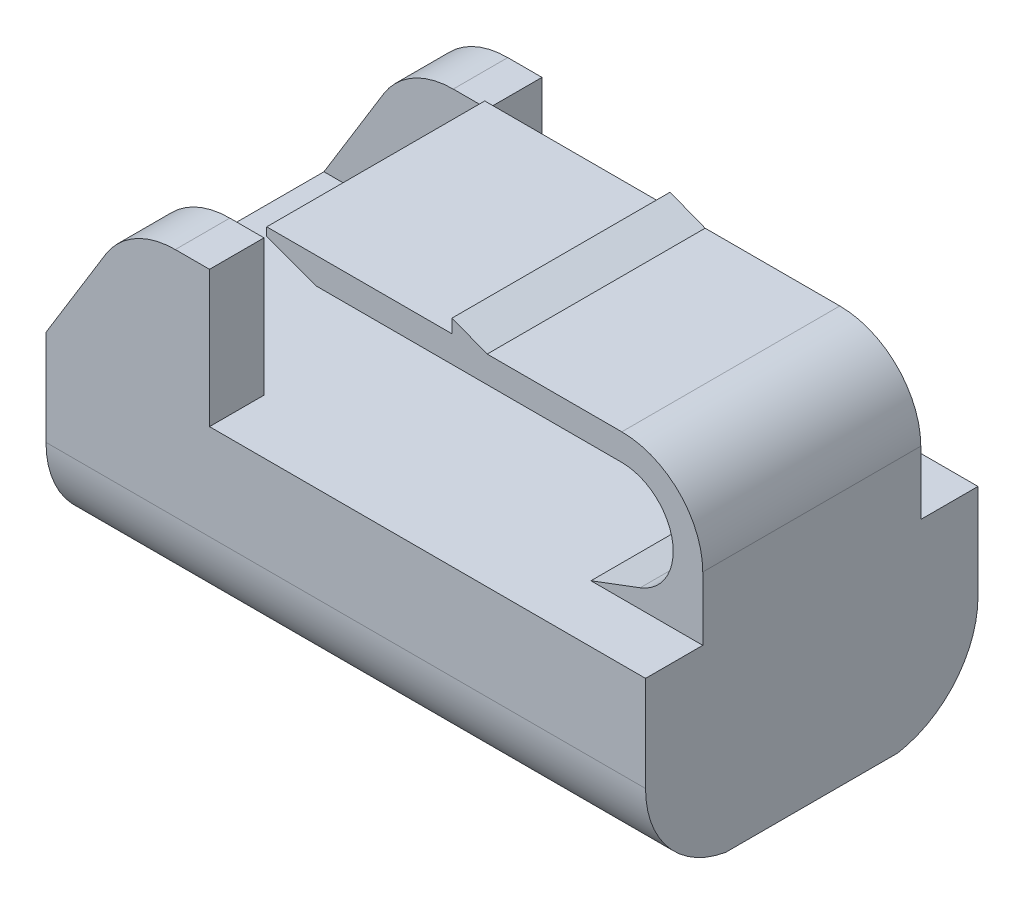
ISO-10303-21;
HEADER;
FILE_DESCRIPTION(('STEP AP214'),'2;1');
FILE_NAME('part.step','',(''),(''),'','','');
FILE_SCHEMA(('AUTOMOTIVE_DESIGN { 1 0 10303 214 1 1 1 1 }'));
ENDSEC;
DATA;
#1=APPLICATION_CONTEXT('core data for automotive mechanical design processes');
#2=APPLICATION_PROTOCOL_DEFINITION('international standard','automotive_design',2000,#1);
#3=PRODUCT_CONTEXT('',#1,'mechanical');
#4=PRODUCT('Part','Part','',(#3));
#5=PRODUCT_RELATED_PRODUCT_CATEGORY('part','',(#4));
#6=PRODUCT_DEFINITION_FORMATION('','',#4);
#7=PRODUCT_DEFINITION_CONTEXT('part definition',#1,'design');
#8=PRODUCT_DEFINITION('design','',#6,#7);
#9=PRODUCT_DEFINITION_SHAPE('','',#8);
#10=(LENGTH_UNIT() NAMED_UNIT(*) SI_UNIT(.MILLI.,.METRE.));
#11=(NAMED_UNIT(*) PLANE_ANGLE_UNIT() SI_UNIT($,.RADIAN.));
#12=(NAMED_UNIT(*) SI_UNIT($,.STERADIAN.) SOLID_ANGLE_UNIT());
#13=UNCERTAINTY_MEASURE_WITH_UNIT(LENGTH_MEASURE(1.E-05),#10,'distance_accuracy_value','');
#14=(GEOMETRIC_REPRESENTATION_CONTEXT(3) GLOBAL_UNCERTAINTY_ASSIGNED_CONTEXT((#13)) GLOBAL_UNIT_ASSIGNED_CONTEXT((#10,
#11,#12)) REPRESENTATION_CONTEXT('',''));
#15=CARTESIAN_POINT('',(0.,0.,0.));
#16=DIRECTION('',(0.,0.,1.));
#17=DIRECTION('',(1.,0.,0.));
#18=AXIS2_PLACEMENT_3D('',#15,#16,#17);
#19=CARTESIAN_POINT('',(0.,7.,0.));
#20=DIRECTION('',(0.,-1.,0.));
#21=DIRECTION('',(0.,0.,-1.));
#22=AXIS2_PLACEMENT_3D('',#19,#20,#21);
#23=PLANE('',#22);
#24=DIRECTION('',(1.,0.,0.));
#25=VECTOR('',#24,1.);
#26=CARTESIAN_POINT('',(17.8957215933598,7.,-10.1));
#27=LINE('',#26,#25);
#28=CARTESIAN_POINT('',(17.8957215933598,7.,-10.1));
#29=VERTEX_POINT('',#28);
#30=CARTESIAN_POINT('',(22.,7.,-10.1));
#31=VERTEX_POINT('',#30);
#32=EDGE_CURVE('E266',#29,#31,#27,.T.);
#33=ORIENTED_EDGE('',*,*,#32,.T.);
#34=DIRECTION('',(0.,0.,-1.));
#35=VECTOR('',#34,1.);
#36=CARTESIAN_POINT('',(22.,7.,0.));
#37=LINE('',#36,#35);
#38=CARTESIAN_POINT('',(22.,7.,-12.2));
#39=VERTEX_POINT('',#38);
#40=EDGE_CURVE('E412',#31,#39,#37,.T.);
#41=ORIENTED_EDGE('',*,*,#40,.T.);
#42=DIRECTION('',(-1.,0.,0.));
#43=VECTOR('',#42,1.);
#44=CARTESIAN_POINT('',(0.,7.,-12.2));
#45=LINE('',#44,#43);
#46=CARTESIAN_POINT('',(6.,7.,-12.2));
#47=VERTEX_POINT('',#46);
#48=EDGE_CURVE('E415',#39,#47,#45,.T.);
#49=ORIENTED_EDGE('',*,*,#48,.T.);
#50=DIRECTION('',(0.,0.,-1.));
#51=VECTOR('',#50,1.);
#52=CARTESIAN_POINT('',(6.,7.,-10.2));
#53=LINE('',#52,#51);
#54=CARTESIAN_POINT('',(6.,7.,-10.2));
#55=VERTEX_POINT('',#54);
#56=EDGE_CURVE('E388',#55,#47,#53,.T.);
#57=ORIENTED_EDGE('',*,*,#56,.F.);
#58=DIRECTION('',(-1.,0.,0.));
#59=VECTOR('',#58,1.);
#60=CARTESIAN_POINT('',(0.,7.,-10.2));
#61=LINE('',#60,#59);
#62=CARTESIAN_POINT('',(0.,7.,-10.2));
#63=VERTEX_POINT('',#62);
#64=EDGE_CURVE('E374',#55,#63,#61,.T.);
#65=ORIENTED_EDGE('',*,*,#64,.T.);
#66=DIRECTION('',(0.,0.,1.));
#67=VECTOR('',#66,1.);
#68=CARTESIAN_POINT('',(0.,7.,0.));
#69=LINE('',#68,#67);
#70=CARTESIAN_POINT('',(0.,7.,-2.));
#71=VERTEX_POINT('',#70);
#72=EDGE_CURVE('E410',#63,#71,#69,.T.);
#73=ORIENTED_EDGE('',*,*,#72,.T.);
#74=DIRECTION('',(-1.,0.,0.));
#75=VECTOR('',#74,1.);
#76=CARTESIAN_POINT('',(0.,7.,-2.));
#77=LINE('',#76,#75);
#78=CARTESIAN_POINT('',(6.,7.,-2.));
#79=VERTEX_POINT('',#78);
#80=EDGE_CURVE('E317',#79,#71,#77,.T.);
#81=ORIENTED_EDGE('',*,*,#80,.F.);
#82=DIRECTION('',(0.,0.,1.));
#83=VECTOR('',#82,1.);
#84=CARTESIAN_POINT('',(6.,7.,-2.));
#85=LINE('',#84,#83);
#86=CARTESIAN_POINT('',(6.,7.,0.));
#87=VERTEX_POINT('',#86);
#88=EDGE_CURVE('E347',#79,#87,#85,.T.);
#89=ORIENTED_EDGE('',*,*,#88,.T.);
#90=DIRECTION('',(1.,0.,0.));
#91=VECTOR('',#90,1.);
#92=CARTESIAN_POINT('',(0.,7.,0.));
#93=LINE('',#92,#91);
#94=CARTESIAN_POINT('',(22.,7.,0.));
#95=VERTEX_POINT('',#94);
#96=EDGE_CURVE('E409',#87,#95,#93,.T.);
#97=ORIENTED_EDGE('',*,*,#96,.T.);
#98=CARTESIAN_POINT('',(22.,7.,-2.1));
#99=VERTEX_POINT('',#98);
#100=EDGE_CURVE('E413',#95,#99,#37,.T.);
#101=ORIENTED_EDGE('',*,*,#100,.T.);
#102=DIRECTION('',(1.,0.,0.));
#103=VECTOR('',#102,1.);
#104=CARTESIAN_POINT('',(17.8957215933598,7.,-2.1));
#105=LINE('',#104,#103);
#106=CARTESIAN_POINT('',(17.8957215933598,7.,-2.1));
#107=VERTEX_POINT('',#106);
#108=EDGE_CURVE('E56',#107,#99,#105,.T.);
#109=ORIENTED_EDGE('',*,*,#108,.F.);
#110=DIRECTION('',(0.,0.,1.));
#111=VECTOR('',#110,1.);
#112=CARTESIAN_POINT('',(17.8957215933598,7.,-10.1));
#113=LINE('',#112,#111);
#114=EDGE_CURVE('E51',#29,#107,#113,.T.);
#115=ORIENTED_EDGE('',*,*,#114,.F.);
#116=EDGE_LOOP('',(#33,#41,#49,#57,#65,#73,#81,#89,#97,#101,#109,#115));
#117=FACE_BOUND('',#116,.T.);
#118=ADVANCED_FACE('F36',(#117),#23,.F.);
#119=CARTESIAN_POINT('',(0.,7.,0.));
#120=DIRECTION('',(1.,0.,0.));
#121=DIRECTION('',(0.,0.,-1.));
#122=AXIS2_PLACEMENT_3D('',#119,#120,#121);
#123=PLANE('',#122);
#124=CARTESIAN_POINT('',(0.,3.5,-8.6469335157469));
#125=DIRECTION('',(1.,0.,0.));
#126=DIRECTION('',(0.,0.,-1.));
#127=AXIS2_PLACEMENT_3D('',#124,#125,#126);
#128=CIRCLE('',#127,3.5530664842531);
#129=CARTESIAN_POINT('',(0.,3.5,-12.2));
#130=VERTEX_POINT('',#129);
#131=CARTESIAN_POINT('',(0.,0.,-9.25871896958074));
#132=VERTEX_POINT('',#131);
#133=EDGE_CURVE('E340',#130,#132,#128,.F.);
#134=ORIENTED_EDGE('',*,*,#133,.T.);
#135=DIRECTION('',(0.,0.,1.));
#136=VECTOR('',#135,1.);
#137=CARTESIAN_POINT('',(0.,0.,0.));
#138=LINE('',#137,#136);
#139=CARTESIAN_POINT('',(0.,0.,-2.94128103041926));
#140=VERTEX_POINT('',#139);
#141=EDGE_CURVE('E403',#132,#140,#138,.T.);
#142=ORIENTED_EDGE('',*,*,#141,.T.);
#143=CARTESIAN_POINT('',(0.,3.5,-3.5530664842531));
#144=DIRECTION('',(1.,0.,0.));
#145=DIRECTION('',(0.,0.,-1.));
#146=AXIS2_PLACEMENT_3D('',#143,#144,#145);
#147=CIRCLE('',#146,3.5530664842531);
#148=CARTESIAN_POINT('',(0.,3.5,0.));
#149=VERTEX_POINT('',#148);
#150=EDGE_CURVE('E390',#149,#140,#147,.T.);
#151=ORIENTED_EDGE('',*,*,#150,.F.);
#152=DIRECTION('',(0.,-1.,0.));
#153=VECTOR('',#152,1.);
#154=CARTESIAN_POINT('',(0.,7.,0.));
#155=LINE('',#154,#153);
#156=CARTESIAN_POINT('',(0.,7.,0.));
#157=VERTEX_POINT('',#156);
#158=EDGE_CURVE('E11',#157,#149,#155,.T.);
#159=ORIENTED_EDGE('',*,*,#158,.F.);
#160=DIRECTION('',(0.,0.,1.));
#161=VECTOR('',#160,1.);
#162=CARTESIAN_POINT('',(0.,7.,-2.));
#163=LINE('',#162,#161);
#164=EDGE_CURVE('E328',#71,#157,#163,.T.);
#165=ORIENTED_EDGE('',*,*,#164,.F.);
#166=ORIENTED_EDGE('',*,*,#72,.F.);
#167=CARTESIAN_POINT('',(0.,7.,-12.2));
#168=VERTEX_POINT('',#167);
#169=EDGE_CURVE('E406',#168,#63,#69,.T.);
#170=ORIENTED_EDGE('',*,*,#169,.F.);
#171=DIRECTION('',(0.,-1.,0.));
#172=VECTOR('',#171,1.);
#173=CARTESIAN_POINT('',(0.,7.,-12.2));
#174=LINE('',#173,#172);
#175=EDGE_CURVE('E418',#168,#130,#174,.T.);
#176=ORIENTED_EDGE('',*,*,#175,.T.);
#177=EDGE_LOOP('',(#134,#142,#151,#159,#165,#166,#170,#176));
#178=FACE_BOUND('',#177,.T.);
#179=ADVANCED_FACE('F38',(#178),#123,.F.);
#180=CARTESIAN_POINT('',(22.,7.,0.));
#181=DIRECTION('',(-1.,0.,0.));
#182=DIRECTION('',(0.,0.,1.));
#183=AXIS2_PLACEMENT_3D('',#180,#181,#182);
#184=PLANE('',#183);
#185=CARTESIAN_POINT('',(22.,3.5,-8.6469335157469));
#186=DIRECTION('',(1.,0.,0.));
#187=DIRECTION('',(0.,0.,1.));
#188=AXIS2_PLACEMENT_3D('',#185,#186,#187);
#189=CIRCLE('',#188,3.5530664842531);
#190=CARTESIAN_POINT('',(22.,0.,-9.25871896958074));
#191=VERTEX_POINT('',#190);
#192=CARTESIAN_POINT('',(22.,3.5,-12.2));
#193=VERTEX_POINT('',#192);
#194=EDGE_CURVE('E354',#191,#193,#189,.T.);
#195=ORIENTED_EDGE('',*,*,#194,.T.);
#196=DIRECTION('',(0.,-1.,0.));
#197=VECTOR('',#196,1.);
#198=CARTESIAN_POINT('',(22.,7.,-12.2));
#199=LINE('',#198,#197);
#200=EDGE_CURVE('E425',#39,#193,#199,.T.);
#201=ORIENTED_EDGE('',*,*,#200,.F.);
#202=ORIENTED_EDGE('',*,*,#40,.F.);
#203=DIRECTION('',(0.,1.,0.));
#204=VECTOR('',#203,1.);
#205=CARTESIAN_POINT('',(22.,7.,-10.1));
#206=LINE('',#205,#204);
#207=CARTESIAN_POINT('',(22.,9.32901464528045,-10.1));
#208=VERTEX_POINT('',#207);
#209=EDGE_CURVE('E221',#31,#208,#206,.T.);
#210=ORIENTED_EDGE('',*,*,#209,.T.);
#211=DIRECTION('',(0.,0.,1.));
#212=VECTOR('',#211,1.);
#213=CARTESIAN_POINT('',(22.,9.32901464528045,-10.1));
#214=LINE('',#213,#212);
#215=CARTESIAN_POINT('',(22.,9.32901464528045,-2.1));
#216=VERTEX_POINT('',#215);
#217=EDGE_CURVE('E214',#208,#216,#214,.T.);
#218=ORIENTED_EDGE('',*,*,#217,.T.);
#219=DIRECTION('',(0.,1.,0.));
#220=VECTOR('',#219,1.);
#221=CARTESIAN_POINT('',(22.,7.,-2.1));
#222=LINE('',#221,#220);
#223=EDGE_CURVE('E219',#99,#216,#222,.T.);
#224=ORIENTED_EDGE('',*,*,#223,.F.);
#225=ORIENTED_EDGE('',*,*,#100,.F.);
#226=DIRECTION('',(0.,-1.,0.));
#227=VECTOR('',#226,1.);
#228=CARTESIAN_POINT('',(22.,7.,0.));
#229=LINE('',#228,#227);
#230=CARTESIAN_POINT('',(22.,3.5,0.));
#231=VERTEX_POINT('',#230);
#232=EDGE_CURVE('E44',#95,#231,#229,.T.);
#233=ORIENTED_EDGE('',*,*,#232,.T.);
#234=CARTESIAN_POINT('',(22.,3.5,-3.5530664842531));
#235=DIRECTION('',(-1.,0.,0.));
#236=DIRECTION('',(0.,0.,-1.));
#237=AXIS2_PLACEMENT_3D('',#234,#235,#236);
#238=CIRCLE('',#237,3.5530664842531);
#239=CARTESIAN_POINT('',(22.,0.,-2.94128103041926));
#240=VERTEX_POINT('',#239);
#241=EDGE_CURVE('E398',#240,#231,#238,.T.);
#242=ORIENTED_EDGE('',*,*,#241,.F.);
#243=DIRECTION('',(0.,0.,-1.));
#244=VECTOR('',#243,1.);
#245=CARTESIAN_POINT('',(22.,0.,0.));
#246=LINE('',#245,#244);
#247=EDGE_CURVE('E420',#240,#191,#246,.T.);
#248=ORIENTED_EDGE('',*,*,#247,.T.);
#249=EDGE_LOOP('',(#195,#201,#202,#210,#218,#224,#225,#233,#242,#248));
#250=FACE_BOUND('',#249,.T.);
#251=ADVANCED_FACE('F217',(#250),#184,.F.);
#252=CARTESIAN_POINT('',(0.,7.,-12.2));
#253=DIRECTION('',(0.,0.,1.));
#254=DIRECTION('',(1.,0.,0.));
#255=AXIS2_PLACEMENT_3D('',#252,#253,#254);
#256=PLANE('',#255);
#257=DIRECTION('',(1.,0.,0.));
#258=VECTOR('',#257,1.);
#259=CARTESIAN_POINT('',(-0.001000000000001,3.5,-12.2));
#260=LINE('',#259,#258);
#261=EDGE_CURVE('E357',#130,#193,#260,.T.);
#262=ORIENTED_EDGE('',*,*,#261,.F.);
#263=ORIENTED_EDGE('',*,*,#175,.F.);
#264=DIRECTION('',(0.522585695015671,0.852586764713708,0.));
#265=VECTOR('',#264,1.);
#266=CARTESIAN_POINT('',(2.18682589632089,10.567757085047,-12.2));
#267=LINE('',#266,#265);
#268=CARTESIAN_POINT('',(2.18682589632089,10.567757085047,-12.2));
#269=VERTEX_POINT('',#268);
#270=EDGE_CURVE('E359',#168,#269,#267,.T.);
#271=ORIENTED_EDGE('',*,*,#270,.T.);
#272=CARTESIAN_POINT('',(4.74458619046201,9.,-12.2));
#273=DIRECTION('',(0.,0.,-1.));
#274=DIRECTION('',(-1.,0.,0.));
#275=AXIS2_PLACEMENT_3D('',#272,#273,#274);
#276=CIRCLE('',#275,3.);
#277=CARTESIAN_POINT('',(4.74458619046201,12.,-12.2));
#278=VERTEX_POINT('',#277);
#279=EDGE_CURVE('E380',#269,#278,#276,.T.);
#280=ORIENTED_EDGE('',*,*,#279,.T.);
#281=DIRECTION('',(1.,0.,0.));
#282=VECTOR('',#281,1.);
#283=CARTESIAN_POINT('',(6.,12.,-12.2));
#284=LINE('',#283,#282);
#285=CARTESIAN_POINT('',(6.,12.,-12.2));
#286=VERTEX_POINT('',#285);
#287=EDGE_CURVE('E383',#278,#286,#284,.T.);
#288=ORIENTED_EDGE('',*,*,#287,.T.);
#289=DIRECTION('',(0.,-1.,0.));
#290=VECTOR('',#289,1.);
#291=CARTESIAN_POINT('',(6.,7.,-12.2));
#292=LINE('',#291,#290);
#293=EDGE_CURVE('E366',#286,#47,#292,.T.);
#294=ORIENTED_EDGE('',*,*,#293,.T.);
#295=ORIENTED_EDGE('',*,*,#48,.F.);
#296=ORIENTED_EDGE('',*,*,#200,.T.);
#297=EDGE_LOOP('',(#262,#263,#271,#280,#288,#294,#295,#296));
#298=FACE_BOUND('',#297,.T.);
#299=ADVANCED_FACE('F448',(#298),#256,.F.);
#300=CARTESIAN_POINT('',(0.,0.,0.));
#301=DIRECTION('',(0.,-1.,0.));
#302=DIRECTION('',(0.,0.,-1.));
#303=AXIS2_PLACEMENT_3D('',#300,#301,#302);
#304=PLANE('',#303);
#305=ORIENTED_EDGE('',*,*,#141,.F.);
#306=DIRECTION('',(1.,0.,0.));
#307=VECTOR('',#306,1.);
#308=CARTESIAN_POINT('',(-0.001000000000001,0.,-9.25871896958074));
#309=LINE('',#308,#307);
#310=EDGE_CURVE('E356',#132,#191,#309,.T.);
#311=ORIENTED_EDGE('',*,*,#310,.T.);
#312=ORIENTED_EDGE('',*,*,#247,.F.);
#313=DIRECTION('',(1.,0.,0.));
#314=VECTOR('',#313,1.);
#315=CARTESIAN_POINT('',(-0.001000000000001,0.,-2.94128103041926));
#316=LINE('',#315,#314);
#317=EDGE_CURVE('E401',#140,#240,#316,.T.);
#318=ORIENTED_EDGE('',*,*,#317,.F.);
#319=EDGE_LOOP('',(#305,#311,#312,#318));
#320=FACE_BOUND('',#319,.T.);
#321=ADVANCED_FACE('F442',(#320),#304,.T.);
#322=CARTESIAN_POINT('',(0.,7.,0.));
#323=DIRECTION('',(0.,0.,-1.));
#324=DIRECTION('',(-1.,0.,0.));
#325=AXIS2_PLACEMENT_3D('',#322,#323,#324);
#326=PLANE('',#325);
#327=DIRECTION('',(1.,0.,0.));
#328=VECTOR('',#327,1.);
#329=CARTESIAN_POINT('',(-0.001000000000001,3.5,0.));
#330=LINE('',#329,#328);
#331=EDGE_CURVE('E400',#149,#231,#330,.T.);
#332=ORIENTED_EDGE('',*,*,#331,.T.);
#333=ORIENTED_EDGE('',*,*,#232,.F.);
#334=ORIENTED_EDGE('',*,*,#96,.F.);
#335=DIRECTION('',(0.,-1.,0.));
#336=VECTOR('',#335,1.);
#337=CARTESIAN_POINT('',(6.,7.,0.));
#338=LINE('',#337,#336);
#339=CARTESIAN_POINT('',(6.,12.,0.));
#340=VERTEX_POINT('',#339);
#341=EDGE_CURVE('E331',#340,#87,#338,.T.);
#342=ORIENTED_EDGE('',*,*,#341,.F.);
#343=DIRECTION('',(1.,0.,0.));
#344=VECTOR('',#343,1.);
#345=CARTESIAN_POINT('',(6.,12.,0.));
#346=LINE('',#345,#344);
#347=CARTESIAN_POINT('',(4.74458619046201,12.,0.));
#348=VERTEX_POINT('',#347);
#349=EDGE_CURVE('E334',#348,#340,#346,.T.);
#350=ORIENTED_EDGE('',*,*,#349,.F.);
#351=CARTESIAN_POINT('',(4.74458619046201,9.,0.));
#352=DIRECTION('',(0.,0.,-1.));
#353=DIRECTION('',(-1.,0.,0.));
#354=AXIS2_PLACEMENT_3D('',#351,#352,#353);
#355=CIRCLE('',#354,3.);
#356=CARTESIAN_POINT('',(2.18682589632089,10.567757085047,0.));
#357=VERTEX_POINT('',#356);
#358=EDGE_CURVE('E318',#357,#348,#355,.T.);
#359=ORIENTED_EDGE('',*,*,#358,.F.);
#360=DIRECTION('',(0.522585695015671,0.852586764713708,0.));
#361=VECTOR('',#360,1.);
#362=CARTESIAN_POINT('',(2.18682589632089,10.567757085047,0.));
#363=LINE('',#362,#361);
#364=EDGE_CURVE('E297',#157,#357,#363,.T.);
#365=ORIENTED_EDGE('',*,*,#364,.F.);
#366=ORIENTED_EDGE('',*,*,#158,.T.);
#367=EDGE_LOOP('',(#332,#333,#334,#342,#350,#359,#365,#366));
#368=FACE_BOUND('',#367,.T.);
#369=ADVANCED_FACE('F432',(#368),#326,.F.);
#370=CARTESIAN_POINT('',(-0.001000000000001,3.5,-3.5530664842531));
#371=DIRECTION('',(1.,0.,0.));
#372=DIRECTION('',(0.,0.,-1.));
#373=AXIS2_PLACEMENT_3D('',#370,#371,#372);
#374=CYLINDRICAL_SURFACE('',#373,3.5530664842531);
#375=ORIENTED_EDGE('',*,*,#150,.T.);
#376=ORIENTED_EDGE('',*,*,#317,.T.);
#377=ORIENTED_EDGE('',*,*,#241,.T.);
#378=ORIENTED_EDGE('',*,*,#331,.F.);
#379=EDGE_LOOP('',(#375,#376,#377,#378));
#380=FACE_BOUND('',#379,.T.);
#381=ADVANCED_FACE('F437',(#380),#374,.T.);
#382=CARTESIAN_POINT('',(2.18682589632089,10.567757085047,-10.2));
#383=DIRECTION('',(-0.852586764713708,0.522585695015671,0.));
#384=DIRECTION('',(-0.522585695015671,-0.852586764713708,0.));
#385=AXIS2_PLACEMENT_3D('',#382,#383,#384);
#386=PLANE('',#385);
#387=ORIENTED_EDGE('',*,*,#270,.F.);
#388=ORIENTED_EDGE('',*,*,#169,.T.);
#389=DIRECTION('',(0.522585695015671,0.852586764713708,0.));
#390=VECTOR('',#389,1.);
#391=CARTESIAN_POINT('',(2.18682589632089,10.567757085047,-10.2));
#392=LINE('',#391,#390);
#393=CARTESIAN_POINT('',(2.18682589632089,10.567757085047,-10.2));
#394=VERTEX_POINT('',#393);
#395=EDGE_CURVE('E362',#63,#394,#392,.T.);
#396=ORIENTED_EDGE('',*,*,#395,.T.);
#397=DIRECTION('',(0.,0.,-1.));
#398=VECTOR('',#397,1.);
#399=CARTESIAN_POINT('',(2.18682589632089,10.567757085047,-10.2));
#400=LINE('',#399,#398);
#401=EDGE_CURVE('E377',#394,#269,#400,.T.);
#402=ORIENTED_EDGE('',*,*,#401,.T.);
#403=EDGE_LOOP('',(#387,#388,#396,#402));
#404=FACE_BOUND('',#403,.T.);
#405=ADVANCED_FACE('F520',(#404),#386,.T.);
#406=CARTESIAN_POINT('',(6.,7.,-10.2));
#407=DIRECTION('',(1.,0.,0.));
#408=DIRECTION('',(0.,0.,-1.));
#409=AXIS2_PLACEMENT_3D('',#406,#407,#408);
#410=PLANE('',#409);
#411=ORIENTED_EDGE('',*,*,#293,.F.);
#412=DIRECTION('',(0.,0.,-1.));
#413=VECTOR('',#412,1.);
#414=CARTESIAN_POINT('',(6.,12.,-10.2));
#415=LINE('',#414,#413);
#416=CARTESIAN_POINT('',(6.,12.,-10.2));
#417=VERTEX_POINT('',#416);
#418=EDGE_CURVE('E391',#417,#286,#415,.T.);
#419=ORIENTED_EDGE('',*,*,#418,.F.);
#420=DIRECTION('',(0.,-1.,0.));
#421=VECTOR('',#420,1.);
#422=CARTESIAN_POINT('',(6.,7.,-10.2));
#423=LINE('',#422,#421);
#424=EDGE_CURVE('E372',#417,#55,#423,.T.);
#425=ORIENTED_EDGE('',*,*,#424,.T.);
#426=ORIENTED_EDGE('',*,*,#56,.T.);
#427=EDGE_LOOP('',(#411,#419,#425,#426));
#428=FACE_BOUND('',#427,.T.);
#429=ADVANCED_FACE('F524',(#428),#410,.T.);
#430=CARTESIAN_POINT('',(6.,12.,-10.2));
#431=DIRECTION('',(0.,1.,0.));
#432=DIRECTION('',(0.,0.,1.));
#433=AXIS2_PLACEMENT_3D('',#430,#431,#432);
#434=PLANE('',#433);
#435=ORIENTED_EDGE('',*,*,#287,.F.);
#436=DIRECTION('',(0.,0.,-1.));
#437=VECTOR('',#436,1.);
#438=CARTESIAN_POINT('',(4.74458619046201,12.,-10.2));
#439=LINE('',#438,#437);
#440=CARTESIAN_POINT('',(4.74458619046201,12.,-10.2));
#441=VERTEX_POINT('',#440);
#442=EDGE_CURVE('E393',#441,#278,#439,.T.);
#443=ORIENTED_EDGE('',*,*,#442,.F.);
#444=DIRECTION('',(1.,0.,0.));
#445=VECTOR('',#444,1.);
#446=CARTESIAN_POINT('',(6.,12.,-10.2));
#447=LINE('',#446,#445);
#448=EDGE_CURVE('E369',#441,#417,#447,.T.);
#449=ORIENTED_EDGE('',*,*,#448,.T.);
#450=ORIENTED_EDGE('',*,*,#418,.T.);
#451=EDGE_LOOP('',(#435,#443,#449,#450));
#452=FACE_BOUND('',#451,.T.);
#453=ADVANCED_FACE('F529',(#452),#434,.T.);
#454=CARTESIAN_POINT('',(4.74458619046201,9.,-10.2));
#455=DIRECTION('',(0.,0.,-1.));
#456=DIRECTION('',(-1.,0.,0.));
#457=AXIS2_PLACEMENT_3D('',#454,#455,#456);
#458=CYLINDRICAL_SURFACE('',#457,3.);
#459=ORIENTED_EDGE('',*,*,#279,.F.);
#460=ORIENTED_EDGE('',*,*,#401,.F.);
#461=CARTESIAN_POINT('',(4.74458619046201,9.,-10.2));
#462=DIRECTION('',(0.,0.,-1.));
#463=DIRECTION('',(-1.,0.,0.));
#464=AXIS2_PLACEMENT_3D('',#461,#462,#463);
#465=CIRCLE('',#464,3.);
#466=EDGE_CURVE('E365',#394,#441,#465,.T.);
#467=ORIENTED_EDGE('',*,*,#466,.T.);
#468=ORIENTED_EDGE('',*,*,#442,.T.);
#469=EDGE_LOOP('',(#459,#460,#467,#468));
#470=FACE_BOUND('',#469,.T.);
#471=ADVANCED_FACE('F533',(#470),#458,.T.);
#472=CARTESIAN_POINT('',(4.74458619046201,9.,-10.2));
#473=DIRECTION('',(0.,0.,-1.));
#474=DIRECTION('',(-1.,0.,0.));
#475=AXIS2_PLACEMENT_3D('',#472,#473,#474);
#476=PLANE('',#475);
#477=ORIENTED_EDGE('',*,*,#395,.F.);
#478=ORIENTED_EDGE('',*,*,#64,.F.);
#479=ORIENTED_EDGE('',*,*,#424,.F.);
#480=ORIENTED_EDGE('',*,*,#448,.F.);
#481=ORIENTED_EDGE('',*,*,#466,.F.);
#482=EDGE_LOOP('',(#477,#478,#479,#480,#481));
#483=FACE_BOUND('',#482,.T.);
#484=ADVANCED_FACE('F536',(#483),#476,.F.);
#485=CARTESIAN_POINT('',(-0.001000000000001,3.5,-8.6469335157469));
#486=DIRECTION('',(1.,0.,0.));
#487=DIRECTION('',(0.,0.,-1.));
#488=AXIS2_PLACEMENT_3D('',#485,#486,#487);
#489=CYLINDRICAL_SURFACE('',#488,3.5530664842531);
#490=ORIENTED_EDGE('',*,*,#261,.T.);
#491=ORIENTED_EDGE('',*,*,#194,.F.);
#492=ORIENTED_EDGE('',*,*,#310,.F.);
#493=ORIENTED_EDGE('',*,*,#133,.F.);
#494=EDGE_LOOP('',(#490,#491,#492,#493));
#495=FACE_BOUND('',#494,.T.);
#496=ADVANCED_FACE('F543',(#495),#489,.T.);
#497=CARTESIAN_POINT('',(2.18682589632089,10.567757085047,-2.));
#498=DIRECTION('',(0.852586764713708,-0.522585695015671,0.));
#499=DIRECTION('',(0.522585695015671,0.852586764713708,0.));
#500=AXIS2_PLACEMENT_3D('',#497,#498,#499);
#501=PLANE('',#500);
#502=ORIENTED_EDGE('',*,*,#364,.T.);
#503=DIRECTION('',(0.,0.,1.));
#504=VECTOR('',#503,1.);
#505=CARTESIAN_POINT('',(2.18682589632089,10.567757085047,-2.));
#506=LINE('',#505,#504);
#507=CARTESIAN_POINT('',(2.18682589632089,10.567757085047,-2.));
#508=VERTEX_POINT('',#507);
#509=EDGE_CURVE('E337',#508,#357,#506,.T.);
#510=ORIENTED_EDGE('',*,*,#509,.F.);
#511=DIRECTION('',(0.522585695015671,0.852586764713708,0.));
#512=VECTOR('',#511,1.);
#513=CARTESIAN_POINT('',(2.18682589632089,10.567757085047,-2.));
#514=LINE('',#513,#512);
#515=EDGE_CURVE('E314',#71,#508,#514,.T.);
#516=ORIENTED_EDGE('',*,*,#515,.F.);
#517=ORIENTED_EDGE('',*,*,#164,.T.);
#518=EDGE_LOOP('',(#502,#510,#516,#517));
#519=FACE_BOUND('',#518,.T.);
#520=ADVANCED_FACE('F547',(#519),#501,.F.);
#521=CARTESIAN_POINT('',(4.74458619046201,9.,-2.));
#522=DIRECTION('',(0.,0.,1.));
#523=DIRECTION('',(1.,0.,0.));
#524=AXIS2_PLACEMENT_3D('',#521,#522,#523);
#525=CYLINDRICAL_SURFACE('',#524,3.);
#526=ORIENTED_EDGE('',*,*,#358,.T.);
#527=DIRECTION('',(0.,0.,1.));
#528=VECTOR('',#527,1.);
#529=CARTESIAN_POINT('',(4.74458619046201,12.,-2.));
#530=LINE('',#529,#528);
#531=CARTESIAN_POINT('',(4.74458619046201,12.,-2.));
#532=VERTEX_POINT('',#531);
#533=EDGE_CURVE('E341',#532,#348,#530,.T.);
#534=ORIENTED_EDGE('',*,*,#533,.F.);
#535=CARTESIAN_POINT('',(4.74458619046201,9.,-2.));
#536=DIRECTION('',(0.,0.,-1.));
#537=DIRECTION('',(-1.,0.,0.));
#538=AXIS2_PLACEMENT_3D('',#535,#536,#537);
#539=CIRCLE('',#538,3.);
#540=EDGE_CURVE('E326',#508,#532,#539,.T.);
#541=ORIENTED_EDGE('',*,*,#540,.F.);
#542=ORIENTED_EDGE('',*,*,#509,.T.);
#543=EDGE_LOOP('',(#526,#534,#541,#542));
#544=FACE_BOUND('',#543,.T.);
#545=ADVANCED_FACE('F550',(#544),#525,.T.);
#546=CARTESIAN_POINT('',(6.,12.,-2.));
#547=DIRECTION('',(0.,-1.,0.));
#548=DIRECTION('',(0.,0.,-1.));
#549=AXIS2_PLACEMENT_3D('',#546,#547,#548);
#550=PLANE('',#549);
#551=ORIENTED_EDGE('',*,*,#349,.T.);
#552=DIRECTION('',(0.,0.,1.));
#553=VECTOR('',#552,1.);
#554=CARTESIAN_POINT('',(6.,12.,-2.));
#555=LINE('',#554,#553);
#556=CARTESIAN_POINT('',(6.,12.,-2.));
#557=VERTEX_POINT('',#556);
#558=EDGE_CURVE('E344',#557,#340,#555,.T.);
#559=ORIENTED_EDGE('',*,*,#558,.F.);
#560=DIRECTION('',(1.,0.,0.));
#561=VECTOR('',#560,1.);
#562=CARTESIAN_POINT('',(6.,12.,-2.));
#563=LINE('',#562,#561);
#564=EDGE_CURVE('E324',#532,#557,#563,.T.);
#565=ORIENTED_EDGE('',*,*,#564,.F.);
#566=ORIENTED_EDGE('',*,*,#533,.T.);
#567=EDGE_LOOP('',(#551,#559,#565,#566));
#568=FACE_BOUND('',#567,.T.);
#569=ADVANCED_FACE('F554',(#568),#550,.F.);
#570=CARTESIAN_POINT('',(6.,7.,-2.));
#571=DIRECTION('',(-1.,0.,0.));
#572=DIRECTION('',(0.,0.,1.));
#573=AXIS2_PLACEMENT_3D('',#570,#571,#572);
#574=PLANE('',#573);
#575=ORIENTED_EDGE('',*,*,#341,.T.);
#576=ORIENTED_EDGE('',*,*,#88,.F.);
#577=DIRECTION('',(0.,-1.,0.));
#578=VECTOR('',#577,1.);
#579=CARTESIAN_POINT('',(6.,7.,-2.));
#580=LINE('',#579,#578);
#581=EDGE_CURVE('E321',#557,#79,#580,.T.);
#582=ORIENTED_EDGE('',*,*,#581,.F.);
#583=ORIENTED_EDGE('',*,*,#558,.T.);
#584=EDGE_LOOP('',(#575,#576,#582,#583));
#585=FACE_BOUND('',#584,.T.);
#586=ADVANCED_FACE('F499',(#585),#574,.F.);
#587=CARTESIAN_POINT('',(4.74458619046201,9.,-2.));
#588=DIRECTION('',(0.,0.,1.));
#589=DIRECTION('',(-1.,0.,0.));
#590=AXIS2_PLACEMENT_3D('',#587,#588,#589);
#591=PLANE('',#590);
#592=ORIENTED_EDGE('',*,*,#515,.T.);
#593=ORIENTED_EDGE('',*,*,#540,.T.);
#594=ORIENTED_EDGE('',*,*,#564,.T.);
#595=ORIENTED_EDGE('',*,*,#581,.T.);
#596=ORIENTED_EDGE('',*,*,#80,.T.);
#597=EDGE_LOOP('',(#592,#593,#594,#595,#596));
#598=FACE_BOUND('',#597,.T.);
#599=ADVANCED_FACE('F492',(#598),#591,.F.);
#600=CARTESIAN_POINT('',(19.702745838166,7.67970527051665,-10.1));
#601=DIRECTION('',(-0.352063800445564,0.935976004188049,0.));
#602=DIRECTION('',(-0.935976004188049,-0.352063800445563,0.));
#603=AXIS2_PLACEMENT_3D('',#600,#601,#602);
#604=PLANE('',#603);
#605=ORIENTED_EDGE('',*,*,#114,.T.);
#606=DIRECTION('',(-0.935976004188049,-0.352063800445563,0.));
#607=VECTOR('',#606,1.);
#608=CARTESIAN_POINT('',(19.702745838166,7.67970527051665,-2.1));
#609=LINE('',#608,#607);
#610=CARTESIAN_POINT('',(19.702745838166,7.67970527051665,-2.1));
#611=VERTEX_POINT('',#610);
#612=EDGE_CURVE('E489',#611,#107,#609,.T.);
#613=ORIENTED_EDGE('',*,*,#612,.F.);
#614=DIRECTION('',(0.,0.,1.));
#615=VECTOR('',#614,1.);
#616=CARTESIAN_POINT('',(19.702745838166,7.67970527051665,-10.1));
#617=LINE('',#616,#615);
#618=CARTESIAN_POINT('',(19.702745838166,7.67970527051665,-10.1));
#619=VERTEX_POINT('',#618);
#620=EDGE_CURVE('E295',#619,#611,#617,.T.);
#621=ORIENTED_EDGE('',*,*,#620,.F.);
#622=DIRECTION('',(-0.935976004188049,-0.352063800445563,0.));
#623=VECTOR('',#622,1.);
#624=CARTESIAN_POINT('',(19.702745838166,7.67970527051665,-10.1));
#625=LINE('',#624,#623);
#626=EDGE_CURVE('E263',#619,#29,#625,.T.);
#627=ORIENTED_EDGE('',*,*,#626,.T.);
#628=EDGE_LOOP('',(#605,#613,#621,#627));
#629=FACE_BOUND('',#628,.T.);
#630=ADVANCED_FACE('F488',(#629),#604,.T.);
#631=CARTESIAN_POINT('',(19.0290146452804,9.44125139266357,-10.1));
#632=DIRECTION('',(0.,0.,1.));
#633=DIRECTION('',(1.,0.,0.));
#634=AXIS2_PLACEMENT_3D('',#631,#632,#633);
#635=CYLINDRICAL_SURFACE('',#634,1.88599004788409);
#636=ORIENTED_EDGE('',*,*,#620,.T.);
#637=CARTESIAN_POINT('',(19.0290146452804,9.44125139266357,-2.1));
#638=DIRECTION('',(0.,0.,-1.));
#639=DIRECTION('',(-1.,0.,0.));
#640=AXIS2_PLACEMENT_3D('',#637,#638,#639);
#641=CIRCLE('',#640,1.88599004788409);
#642=CARTESIAN_POINT('',(19.0290146452804,11.3272414405476,-2.1));
#643=VERTEX_POINT('',#642);
#644=EDGE_CURVE('E260',#643,#611,#641,.T.);
#645=ORIENTED_EDGE('',*,*,#644,.F.);
#646=DIRECTION('',(0.,0.,1.));
#647=VECTOR('',#646,1.);
#648=CARTESIAN_POINT('',(19.0290146452804,11.3272414405476,-10.1));
#649=LINE('',#648,#647);
#650=CARTESIAN_POINT('',(19.0290146452804,11.3272414405476,-10.1));
#651=VERTEX_POINT('',#650);
#652=EDGE_CURVE('E298',#651,#643,#649,.T.);
#653=ORIENTED_EDGE('',*,*,#652,.F.);
#654=CARTESIAN_POINT('',(19.0290146452804,9.44125139266357,-10.1));
#655=DIRECTION('',(0.,0.,-1.));
#656=DIRECTION('',(-1.,0.,0.));
#657=AXIS2_PLACEMENT_3D('',#654,#655,#656);
#658=CIRCLE('',#657,1.88599004788409);
#659=EDGE_CURVE('E292',#651,#619,#658,.T.);
#660=ORIENTED_EDGE('',*,*,#659,.T.);
#661=EDGE_LOOP('',(#636,#645,#653,#660));
#662=FACE_BOUND('',#661,.T.);
#663=ADVANCED_FACE('F486',(#662),#635,.F.);
#664=CARTESIAN_POINT('',(7.8156859983328,11.3272414405476,-10.1));
#665=DIRECTION('',(0.,-1.,0.));
#666=DIRECTION('',(0.,0.,-1.));
#667=AXIS2_PLACEMENT_3D('',#664,#665,#666);
#668=PLANE('',#667);
#669=ORIENTED_EDGE('',*,*,#652,.T.);
#670=DIRECTION('',(1.,0.,0.));
#671=VECTOR('',#670,1.);
#672=CARTESIAN_POINT('',(7.8156859983328,11.3272414405476,-2.1));
#673=LINE('',#672,#671);
#674=CARTESIAN_POINT('',(7.8156859983328,11.3272414405476,-2.1));
#675=VERTEX_POINT('',#674);
#676=EDGE_CURVE('E257',#675,#643,#673,.T.);
#677=ORIENTED_EDGE('',*,*,#676,.F.);
#678=DIRECTION('',(0.,0.,1.));
#679=VECTOR('',#678,1.);
#680=CARTESIAN_POINT('',(7.8156859983328,11.3272414405476,-10.1));
#681=LINE('',#680,#679);
#682=CARTESIAN_POINT('',(7.8156859983328,11.3272414405476,-10.1));
#683=VERTEX_POINT('',#682);
#684=EDGE_CURVE('E300',#683,#675,#681,.T.);
#685=ORIENTED_EDGE('',*,*,#684,.F.);
#686=DIRECTION('',(1.,0.,0.));
#687=VECTOR('',#686,1.);
#688=CARTESIAN_POINT('',(7.8156859983328,11.3272414405476,-10.1));
#689=LINE('',#688,#687);
#690=EDGE_CURVE('E289',#683,#651,#689,.T.);
#691=ORIENTED_EDGE('',*,*,#690,.T.);
#692=EDGE_LOOP('',(#669,#677,#685,#691));
#693=FACE_BOUND('',#692,.T.);
#694=ADVANCED_FACE('F481',(#693),#668,.T.);
#695=CARTESIAN_POINT('',(6.,12.,-10.1));
#696=DIRECTION('',(-0.347442541915938,-0.937701274429651,0.));
#697=DIRECTION('',(0.937701274429651,-0.347442541915938,0.));
#698=AXIS2_PLACEMENT_3D('',#695,#696,#697);
#699=PLANE('',#698);
#700=ORIENTED_EDGE('',*,*,#684,.T.);
#701=DIRECTION('',(0.937701274429651,-0.347442541915938,0.));
#702=VECTOR('',#701,1.);
#703=CARTESIAN_POINT('',(6.,12.,-2.1));
#704=LINE('',#703,#702);
#705=CARTESIAN_POINT('',(6.,12.,-2.1));
#706=VERTEX_POINT('',#705);
#707=EDGE_CURVE('E254',#706,#675,#704,.T.);
#708=ORIENTED_EDGE('',*,*,#707,.F.);
#709=DIRECTION('',(0.,0.,1.));
#710=VECTOR('',#709,1.);
#711=CARTESIAN_POINT('',(6.,12.,-10.1));
#712=LINE('',#711,#710);
#713=CARTESIAN_POINT('',(6.,12.,-10.1));
#714=VERTEX_POINT('',#713);
#715=EDGE_CURVE('E302',#714,#706,#712,.T.);
#716=ORIENTED_EDGE('',*,*,#715,.F.);
#717=DIRECTION('',(0.937701274429651,-0.347442541915938,0.));
#718=VECTOR('',#717,1.);
#719=CARTESIAN_POINT('',(6.,12.,-10.1));
#720=LINE('',#719,#718);
#721=EDGE_CURVE('E286',#714,#683,#720,.T.);
#722=ORIENTED_EDGE('',*,*,#721,.T.);
#723=EDGE_LOOP('',(#700,#708,#716,#722));
#724=FACE_BOUND('',#723,.T.);
#725=ADVANCED_FACE('F477',(#724),#699,.T.);
#726=CARTESIAN_POINT('',(6.,12.3,-10.1));
#727=DIRECTION('',(-1.,0.,0.));
#728=DIRECTION('',(0.,0.,1.));
#729=AXIS2_PLACEMENT_3D('',#726,#727,#728);
#730=PLANE('',#729);
#731=ORIENTED_EDGE('',*,*,#715,.T.);
#732=DIRECTION('',(0.,-1.,0.));
#733=VECTOR('',#732,1.);
#734=CARTESIAN_POINT('',(6.,12.3,-2.1));
#735=LINE('',#734,#733);
#736=CARTESIAN_POINT('',(6.,12.3,-2.1));
#737=VERTEX_POINT('',#736);
#738=EDGE_CURVE('E251',#737,#706,#735,.T.);
#739=ORIENTED_EDGE('',*,*,#738,.F.);
#740=DIRECTION('',(0.,0.,1.));
#741=VECTOR('',#740,1.);
#742=CARTESIAN_POINT('',(6.,12.3,-10.1));
#743=LINE('',#742,#741);
#744=CARTESIAN_POINT('',(6.,12.3,-10.1));
#745=VERTEX_POINT('',#744);
#746=EDGE_CURVE('E304',#745,#737,#743,.T.);
#747=ORIENTED_EDGE('',*,*,#746,.F.);
#748=DIRECTION('',(0.,-1.,0.));
#749=VECTOR('',#748,1.);
#750=CARTESIAN_POINT('',(6.,12.3,-10.1));
#751=LINE('',#750,#749);
#752=EDGE_CURVE('E283',#745,#714,#751,.T.);
#753=ORIENTED_EDGE('',*,*,#752,.T.);
#754=EDGE_LOOP('',(#731,#739,#747,#753));
#755=FACE_BOUND('',#754,.T.);
#756=ADVANCED_FACE('F475',(#755),#730,.T.);
#757=CARTESIAN_POINT('',(12.8,12.3,-10.1));
#758=DIRECTION('',(0.,1.,0.));
#759=DIRECTION('',(-1.,0.,0.));
#760=AXIS2_PLACEMENT_3D('',#757,#758,#759);
#761=PLANE('',#760);
#762=ORIENTED_EDGE('',*,*,#746,.T.);
#763=DIRECTION('',(-1.,0.,0.));
#764=VECTOR('',#763,1.);
#765=CARTESIAN_POINT('',(12.8,12.3,-2.1));
#766=LINE('',#765,#764);
#767=CARTESIAN_POINT('',(12.8,12.3,-2.1));
#768=VERTEX_POINT('',#767);
#769=EDGE_CURVE('E248',#768,#737,#766,.T.);
#770=ORIENTED_EDGE('',*,*,#769,.F.);
#771=DIRECTION('',(0.,0.,1.));
#772=VECTOR('',#771,1.);
#773=CARTESIAN_POINT('',(12.8,12.3,-10.1));
#774=LINE('',#773,#772);
#775=CARTESIAN_POINT('',(12.8,12.3,-10.1));
#776=VERTEX_POINT('',#775);
#777=EDGE_CURVE('E306',#776,#768,#774,.T.);
#778=ORIENTED_EDGE('',*,*,#777,.F.);
#779=DIRECTION('',(-1.,0.,0.));
#780=VECTOR('',#779,1.);
#781=CARTESIAN_POINT('',(12.8,12.3,-10.1));
#782=LINE('',#781,#780);
#783=EDGE_CURVE('E280',#776,#745,#782,.T.);
#784=ORIENTED_EDGE('',*,*,#783,.T.);
#785=EDGE_LOOP('',(#762,#770,#778,#784));
#786=FACE_BOUND('',#785,.T.);
#787=ADVANCED_FACE('F470',(#786),#761,.T.);
#788=CARTESIAN_POINT('',(12.8,12.8,-10.1));
#789=DIRECTION('',(-1.,0.,0.));
#790=DIRECTION('',(0.,0.,1.));
#791=AXIS2_PLACEMENT_3D('',#788,#789,#790);
#792=PLANE('',#791);
#793=ORIENTED_EDGE('',*,*,#777,.T.);
#794=DIRECTION('',(0.,-1.,0.));
#795=VECTOR('',#794,1.);
#796=CARTESIAN_POINT('',(12.8,12.8,-2.1));
#797=LINE('',#796,#795);
#798=CARTESIAN_POINT('',(12.8,12.8,-2.1));
#799=VERTEX_POINT('',#798);
#800=EDGE_CURVE('E245',#799,#768,#797,.T.);
#801=ORIENTED_EDGE('',*,*,#800,.F.);
#802=DIRECTION('',(0.,0.,1.));
#803=VECTOR('',#802,1.);
#804=CARTESIAN_POINT('',(12.8,12.8,-10.1));
#805=LINE('',#804,#803);
#806=CARTESIAN_POINT('',(12.8,12.8,-10.1));
#807=VERTEX_POINT('',#806);
#808=EDGE_CURVE('E308',#807,#799,#805,.T.);
#809=ORIENTED_EDGE('',*,*,#808,.F.);
#810=DIRECTION('',(0.,-1.,0.));
#811=VECTOR('',#810,1.);
#812=CARTESIAN_POINT('',(12.8,12.8,-10.1));
#813=LINE('',#812,#811);
#814=EDGE_CURVE('E277',#807,#776,#813,.T.);
#815=ORIENTED_EDGE('',*,*,#814,.T.);
#816=EDGE_LOOP('',(#793,#801,#809,#815));
#817=FACE_BOUND('',#816,.T.);
#818=ADVANCED_FACE('F465',(#817),#792,.T.);
#819=CARTESIAN_POINT('',(14.087770897482,12.3,-10.1));
#820=DIRECTION('',(0.361943304988286,0.932200109404712,0.));
#821=DIRECTION('',(-0.932200109404712,0.361943304988286,0.));
#822=AXIS2_PLACEMENT_3D('',#819,#820,#821);
#823=PLANE('',#822);
#824=ORIENTED_EDGE('',*,*,#808,.T.);
#825=DIRECTION('',(-0.932200109404712,0.361943304988286,0.));
#826=VECTOR('',#825,1.);
#827=CARTESIAN_POINT('',(14.087770897482,12.3,-2.1));
#828=LINE('',#827,#826);
#829=CARTESIAN_POINT('',(14.087770897482,12.3,-2.1));
#830=VERTEX_POINT('',#829);
#831=EDGE_CURVE('E239',#830,#799,#828,.T.);
#832=ORIENTED_EDGE('',*,*,#831,.F.);
#833=DIRECTION('',(0.,0.,1.));
#834=VECTOR('',#833,1.);
#835=CARTESIAN_POINT('',(14.087770897482,12.3,-10.1));
#836=LINE('',#835,#834);
#837=CARTESIAN_POINT('',(14.087770897482,12.3,-10.1));
#838=VERTEX_POINT('',#837);
#839=EDGE_CURVE('E310',#838,#830,#836,.T.);
#840=ORIENTED_EDGE('',*,*,#839,.F.);
#841=DIRECTION('',(-0.932200109404712,0.361943304988286,0.));
#842=VECTOR('',#841,1.);
#843=CARTESIAN_POINT('',(14.087770897482,12.3,-10.1));
#844=LINE('',#843,#842);
#845=EDGE_CURVE('E274',#838,#807,#844,.T.);
#846=ORIENTED_EDGE('',*,*,#845,.T.);
#847=EDGE_LOOP('',(#824,#832,#840,#846));
#848=FACE_BOUND('',#847,.T.);
#849=ADVANCED_FACE('F463',(#848),#823,.T.);
#850=CARTESIAN_POINT('',(19.0290146452804,12.3,-10.1));
#851=DIRECTION('',(0.,1.,0.));
#852=DIRECTION('',(0.,0.,1.));
#853=AXIS2_PLACEMENT_3D('',#850,#851,#852);
#854=PLANE('',#853);
#855=ORIENTED_EDGE('',*,*,#839,.T.);
#856=DIRECTION('',(-1.,0.,0.));
#857=VECTOR('',#856,1.);
#858=CARTESIAN_POINT('',(19.0290146452804,12.3,-2.1));
#859=LINE('',#858,#857);
#860=CARTESIAN_POINT('',(19.0290146452804,12.3,-2.1));
#861=VERTEX_POINT('',#860);
#862=EDGE_CURVE('E237',#861,#830,#859,.T.);
#863=ORIENTED_EDGE('',*,*,#862,.F.);
#864=DIRECTION('',(0.,0.,1.));
#865=VECTOR('',#864,1.);
#866=CARTESIAN_POINT('',(19.0290146452804,12.3,-10.1));
#867=LINE('',#866,#865);
#868=CARTESIAN_POINT('',(19.0290146452804,12.3,-10.1));
#869=VERTEX_POINT('',#868);
#870=EDGE_CURVE('E226',#869,#861,#867,.T.);
#871=ORIENTED_EDGE('',*,*,#870,.F.);
#872=DIRECTION('',(-1.,0.,0.));
#873=VECTOR('',#872,1.);
#874=CARTESIAN_POINT('',(19.0290146452804,12.3,-10.1));
#875=LINE('',#874,#873);
#876=EDGE_CURVE('E271',#869,#838,#875,.T.);
#877=ORIENTED_EDGE('',*,*,#876,.T.);
#878=EDGE_LOOP('',(#855,#863,#871,#877));
#879=FACE_BOUND('',#878,.T.);
#880=ADVANCED_FACE('F459',(#879),#854,.T.);
#881=CARTESIAN_POINT('',(19.0290146452804,9.32901464528045,-10.1));
#882=DIRECTION('',(0.,0.,1.));
#883=DIRECTION('',(1.,0.,0.));
#884=AXIS2_PLACEMENT_3D('',#881,#882,#883);
#885=CYLINDRICAL_SURFACE('',#884,2.97098535471956);
#886=ORIENTED_EDGE('',*,*,#870,.T.);
#887=CARTESIAN_POINT('',(19.0290146452804,9.32901464528045,-2.1));
#888=DIRECTION('',(0.,0.,1.));
#889=DIRECTION('',(1.,0.,0.));
#890=AXIS2_PLACEMENT_3D('',#887,#888,#889);
#891=CIRCLE('',#890,2.97098535471956);
#892=EDGE_CURVE('E233',#216,#861,#891,.T.);
#893=ORIENTED_EDGE('',*,*,#892,.F.);
#894=ORIENTED_EDGE('',*,*,#217,.F.);
#895=CARTESIAN_POINT('',(19.0290146452804,9.32901464528045,-10.1));
#896=DIRECTION('',(0.,0.,1.));
#897=DIRECTION('',(1.,0.,0.));
#898=AXIS2_PLACEMENT_3D('',#895,#896,#897);
#899=CIRCLE('',#898,2.97098535471956);
#900=EDGE_CURVE('E269',#208,#869,#899,.T.);
#901=ORIENTED_EDGE('',*,*,#900,.T.);
#902=EDGE_LOOP('',(#886,#893,#894,#901));
#903=FACE_BOUND('',#902,.T.);
#904=ADVANCED_FACE('F236',(#903),#885,.T.);
#905=CARTESIAN_POINT('',(19.0290146452804,9.32901464528045,-10.1));
#906=DIRECTION('',(0.,0.,1.));
#907=DIRECTION('',(1.,0.,0.));
#908=AXIS2_PLACEMENT_3D('',#905,#906,#907);
#909=PLANE('',#908);
#910=ORIENTED_EDGE('',*,*,#626,.F.);
#911=ORIENTED_EDGE('',*,*,#659,.F.);
#912=ORIENTED_EDGE('',*,*,#690,.F.);
#913=ORIENTED_EDGE('',*,*,#721,.F.);
#914=ORIENTED_EDGE('',*,*,#752,.F.);
#915=ORIENTED_EDGE('',*,*,#783,.F.);
#916=ORIENTED_EDGE('',*,*,#814,.F.);
#917=ORIENTED_EDGE('',*,*,#845,.F.);
#918=ORIENTED_EDGE('',*,*,#876,.F.);
#919=ORIENTED_EDGE('',*,*,#900,.F.);
#920=ORIENTED_EDGE('',*,*,#209,.F.);
#921=ORIENTED_EDGE('',*,*,#32,.F.);
#922=EDGE_LOOP('',(#910,#911,#912,#913,#914,#915,#916,#917,#918,#919,#920,#921));
#923=FACE_BOUND('',#922,.T.);
#924=ADVANCED_FACE('F454',(#923),#909,.F.);
#925=CARTESIAN_POINT('',(19.0290146452804,9.32901464528045,-2.1));
#926=DIRECTION('',(0.,0.,1.));
#927=DIRECTION('',(1.,0.,0.));
#928=AXIS2_PLACEMENT_3D('',#925,#926,#927);
#929=PLANE('',#928);
#930=ORIENTED_EDGE('',*,*,#612,.T.);
#931=ORIENTED_EDGE('',*,*,#108,.T.);
#932=ORIENTED_EDGE('',*,*,#223,.T.);
#933=ORIENTED_EDGE('',*,*,#892,.T.);
#934=ORIENTED_EDGE('',*,*,#862,.T.);
#935=ORIENTED_EDGE('',*,*,#831,.T.);
#936=ORIENTED_EDGE('',*,*,#800,.T.);
#937=ORIENTED_EDGE('',*,*,#769,.T.);
#938=ORIENTED_EDGE('',*,*,#738,.T.);
#939=ORIENTED_EDGE('',*,*,#707,.T.);
#940=ORIENTED_EDGE('',*,*,#676,.T.);
#941=ORIENTED_EDGE('',*,*,#644,.T.);
#942=EDGE_LOOP('',(#930,#931,#932,#933,#934,#935,#936,#937,#938,#939,#940,#941));
#943=FACE_BOUND('',#942,.T.);
#944=ADVANCED_FACE('F231',(#943),#929,.T.);
#945=CLOSED_SHELL('',(#118,#179,#251,#299,#321,#369,#381,#405,#429,#453,#471,#484,#496,#520,
#545,#569,#586,#599,#630,#663,#694,#725,#756,#787,#818,#849,#880,#904,#924,#944));
#946=MANIFOLD_SOLID_BREP('B2',#945);
#947=ADVANCED_BREP_SHAPE_REPRESENTATION('',(#18,#946),#14);
#948=SHAPE_DEFINITION_REPRESENTATION(#9,#947);
ENDSEC;
END-ISO-10303-21;
